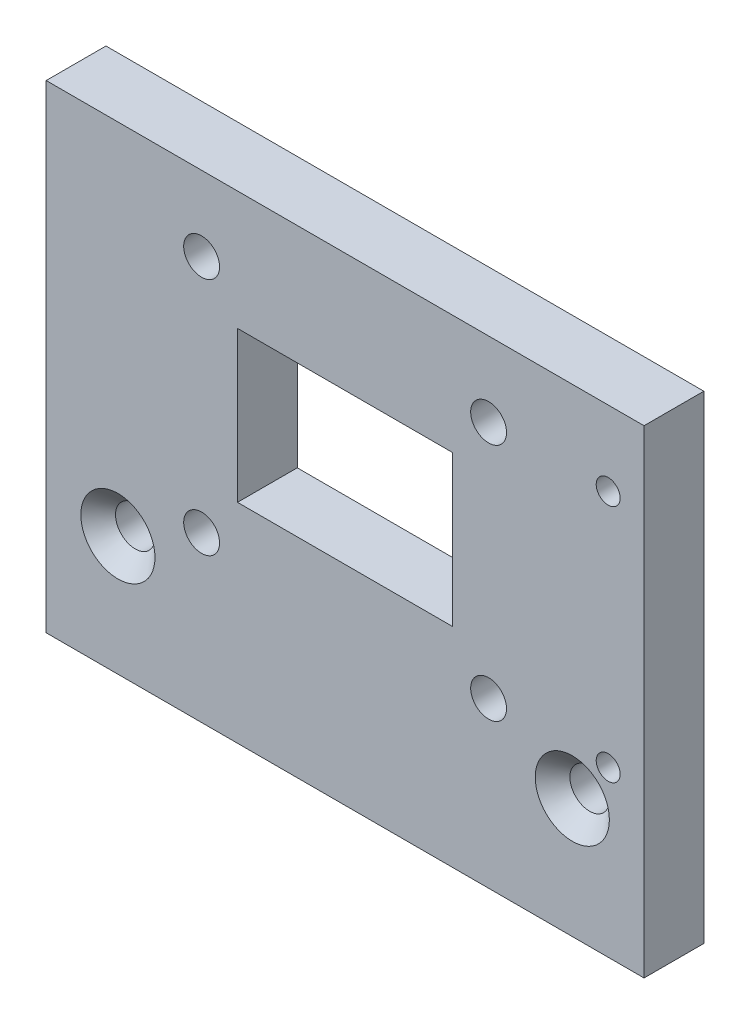
ISO-10303-21;
HEADER;
FILE_DESCRIPTION(('STEP AP214'),'2;1');
FILE_NAME('part.step','',(''),(''),'','','');
FILE_SCHEMA(('AUTOMOTIVE_DESIGN { 1 0 10303 214 1 1 1 1 }'));
ENDSEC;
DATA;
#1=APPLICATION_CONTEXT('core data for automotive mechanical design processes');
#2=APPLICATION_PROTOCOL_DEFINITION('international standard','automotive_design',2000,#1);
#3=PRODUCT_CONTEXT('',#1,'mechanical');
#4=PRODUCT('Part','Part','',(#3));
#5=PRODUCT_RELATED_PRODUCT_CATEGORY('part','',(#4));
#6=PRODUCT_DEFINITION_FORMATION('','',#4);
#7=PRODUCT_DEFINITION_CONTEXT('part definition',#1,'design');
#8=PRODUCT_DEFINITION('design','',#6,#7);
#9=PRODUCT_DEFINITION_SHAPE('','',#8);
#10=(LENGTH_UNIT() NAMED_UNIT(*) SI_UNIT(.MILLI.,.METRE.));
#11=(NAMED_UNIT(*) PLANE_ANGLE_UNIT() SI_UNIT($,.RADIAN.));
#12=(NAMED_UNIT(*) SI_UNIT($,.STERADIAN.) SOLID_ANGLE_UNIT());
#13=UNCERTAINTY_MEASURE_WITH_UNIT(LENGTH_MEASURE(1.E-05),#10,'distance_accuracy_value','');
#14=(GEOMETRIC_REPRESENTATION_CONTEXT(3) GLOBAL_UNCERTAINTY_ASSIGNED_CONTEXT((#13)) GLOBAL_UNIT_ASSIGNED_CONTEXT((#10,
#11,#12)) REPRESENTATION_CONTEXT('',''));
#15=CARTESIAN_POINT('',(0.,0.,0.));
#16=DIRECTION('',(0.,0.,1.));
#17=DIRECTION('',(1.,0.,0.));
#18=AXIS2_PLACEMENT_3D('',#15,#16,#17);
#19=CARTESIAN_POINT('',(12.,20.,10.0022999999965));
#20=DIRECTION('',(0.,0.,1.));
#21=DIRECTION('',(1.,0.,0.));
#22=AXIS2_PLACEMENT_3D('',#19,#20,#21);
#23=CONICAL_SURFACE('',#22,6.1999999999789,0.785398163387648);
#24=CARTESIAN_POINT('',(12.,20.,7.1023));
#25=DIRECTION('',(0.,0.,1.));
#26=DIRECTION('',(1.,0.,0.));
#27=AXIS2_PLACEMENT_3D('',#24,#25,#26);
#28=CIRCLE('',#27,3.3);
#29=CARTESIAN_POINT('',(15.3,20.,7.1023));
#30=VERTEX_POINT('',#29);
#31=EDGE_CURVE('E147',#30,#30,#28,.F.);
#32=ORIENTED_EDGE('',*,*,#31,.T.);
#33=EDGE_LOOP('',(#32));
#34=FACE_BOUND('',#33,.T.);
#35=CARTESIAN_POINT('',(12.,20.,10.0022999999965));
#36=DIRECTION('',(0.,0.,1.));
#37=DIRECTION('',(1.,0.,0.));
#38=AXIS2_PLACEMENT_3D('',#35,#36,#37);
#39=CIRCLE('',#38,6.1999999999789);
#40=CARTESIAN_POINT('',(18.1999999999789,20.,10.0022999999965));
#41=VERTEX_POINT('',#40);
#42=EDGE_CURVE('E19',#41,#41,#39,.F.);
#43=ORIENTED_EDGE('',*,*,#42,.F.);
#44=EDGE_LOOP('',(#43));
#45=FACE_BOUND('',#44,.T.);
#46=ADVANCED_FACE('F16',(#34,#45),#23,.F.);
#47=CARTESIAN_POINT('',(88.,20.,10.0022999999396));
#48=DIRECTION('',(0.,0.,1.));
#49=DIRECTION('',(1.,0.,0.));
#50=AXIS2_PLACEMENT_3D('',#47,#48,#49);
#51=CONICAL_SURFACE('',#50,6.19999999994389,0.785398163397448);
#52=CARTESIAN_POINT('',(88.,20.,7.1023));
#53=DIRECTION('',(0.,0.,1.));
#54=DIRECTION('',(1.,0.,0.));
#55=AXIS2_PLACEMENT_3D('',#52,#53,#54);
#56=CIRCLE('',#55,3.3);
#57=CARTESIAN_POINT('',(91.3,20.,7.1023));
#58=VERTEX_POINT('',#57);
#59=EDGE_CURVE('E141',#58,#58,#56,.F.);
#60=ORIENTED_EDGE('',*,*,#59,.T.);
#61=EDGE_LOOP('',(#60));
#62=FACE_BOUND('',#61,.T.);
#63=CARTESIAN_POINT('',(88.,20.,10.0022999999742));
#64=DIRECTION('',(0.,0.,1.));
#65=DIRECTION('',(1.,0.,0.));
#66=AXIS2_PLACEMENT_3D('',#63,#64,#65);
#67=CIRCLE('',#66,6.19999999997844);
#68=CARTESIAN_POINT('',(94.1999999999784,20.,10.0022999999742));
#69=VERTEX_POINT('',#68);
#70=EDGE_CURVE('E90',#69,#69,#67,.F.);
#71=ORIENTED_EDGE('',*,*,#70,.F.);
#72=EDGE_LOOP('',(#71));
#73=FACE_BOUND('',#72,.T.);
#74=ADVANCED_FACE('F156',(#62,#73),#51,.F.);
#75=CARTESIAN_POINT('',(0.,0.,10.0023));
#76=DIRECTION('',(0.,0.,1.));
#77=DIRECTION('',(1.,0.,0.));
#78=AXIS2_PLACEMENT_3D('',#75,#76,#77);
#79=PLANE('',#78);
#80=CARTESIAN_POINT('',(94.,67.5,10.0023));
#81=DIRECTION('',(0.,0.,1.));
#82=DIRECTION('',(1.,0.,0.));
#83=AXIS2_PLACEMENT_3D('',#80,#81,#82);
#84=CIRCLE('',#83,2.);
#85=CARTESIAN_POINT('',(96.,67.5,10.0023));
#86=VERTEX_POINT('',#85);
#87=EDGE_CURVE('E128',#86,#86,#84,.F.);
#88=ORIENTED_EDGE('',*,*,#87,.T.);
#89=EDGE_LOOP('',(#88));
#90=FACE_BOUND('',#89,.T.);
#91=CARTESIAN_POINT('',(74.,67.5,10.0023));
#92=DIRECTION('',(0.,0.,1.));
#93=DIRECTION('',(1.,0.,0.));
#94=AXIS2_PLACEMENT_3D('',#91,#92,#93);
#95=CIRCLE('',#94,3.);
#96=CARTESIAN_POINT('',(77.,67.5,10.0023));
#97=VERTEX_POINT('',#96);
#98=EDGE_CURVE('E131',#97,#97,#95,.F.);
#99=ORIENTED_EDGE('',*,*,#98,.T.);
#100=EDGE_LOOP('',(#99));
#101=FACE_BOUND('',#100,.T.);
#102=CARTESIAN_POINT('',(26.,67.5,10.0023));
#103=DIRECTION('',(0.,0.,1.));
#104=DIRECTION('',(1.,0.,0.));
#105=AXIS2_PLACEMENT_3D('',#102,#103,#104);
#106=CIRCLE('',#105,3.);
#107=CARTESIAN_POINT('',(29.,67.5,10.0023));
#108=VERTEX_POINT('',#107);
#109=EDGE_CURVE('E134',#108,#108,#106,.F.);
#110=ORIENTED_EDGE('',*,*,#109,.T.);
#111=EDGE_LOOP('',(#110));
#112=FACE_BOUND('',#111,.T.);
#113=DIRECTION('',(0.,1.,0.));
#114=VECTOR('',#113,1.);
#115=CARTESIAN_POINT('',(68.,34.9,10.0023));
#116=LINE('',#115,#114);
#117=CARTESIAN_POINT('',(68.,60.1,10.0023));
#118=VERTEX_POINT('',#117);
#119=CARTESIAN_POINT('',(68.,34.9,10.0023));
#120=VERTEX_POINT('',#119);
#121=EDGE_CURVE('E246',#118,#120,#116,.F.);
#122=ORIENTED_EDGE('',*,*,#121,.T.);
#123=DIRECTION('',(1.,0.,0.));
#124=VECTOR('',#123,1.);
#125=CARTESIAN_POINT('',(32.,34.9,10.0023));
#126=LINE('',#125,#124);
#127=CARTESIAN_POINT('',(32.,34.9,10.0023));
#128=VERTEX_POINT('',#127);
#129=EDGE_CURVE('E255',#128,#120,#126,.T.);
#130=ORIENTED_EDGE('',*,*,#129,.F.);
#131=DIRECTION('',(0.,1.,0.));
#132=VECTOR('',#131,1.);
#133=CARTESIAN_POINT('',(32.,34.9,10.0023));
#134=LINE('',#133,#132);
#135=CARTESIAN_POINT('',(32.,60.1,10.0023));
#136=VERTEX_POINT('',#135);
#137=EDGE_CURVE('E140',#136,#128,#134,.F.);
#138=ORIENTED_EDGE('',*,*,#137,.F.);
#139=DIRECTION('',(1.,0.,0.));
#140=VECTOR('',#139,1.);
#141=CARTESIAN_POINT('',(32.,60.1,10.0023));
#142=LINE('',#141,#140);
#143=EDGE_CURVE('E257',#136,#118,#142,.T.);
#144=ORIENTED_EDGE('',*,*,#143,.T.);
#145=EDGE_LOOP('',(#122,#130,#138,#144));
#146=FACE_BOUND('',#145,.T.);
#147=CARTESIAN_POINT('',(94.,27.5,10.0023));
#148=DIRECTION('',(0.,0.,1.));
#149=DIRECTION('',(1.,0.,0.));
#150=AXIS2_PLACEMENT_3D('',#147,#148,#149);
#151=CIRCLE('',#150,2.);
#152=CARTESIAN_POINT('',(96.,27.5,10.0023));
#153=VERTEX_POINT('',#152);
#154=EDGE_CURVE('E137',#153,#153,#151,.F.);
#155=ORIENTED_EDGE('',*,*,#154,.T.);
#156=EDGE_LOOP('',(#155));
#157=FACE_BOUND('',#156,.T.);
#158=CARTESIAN_POINT('',(74.,27.5,10.0023));
#159=DIRECTION('',(0.,0.,1.));
#160=DIRECTION('',(1.,0.,0.));
#161=AXIS2_PLACEMENT_3D('',#158,#159,#160);
#162=CIRCLE('',#161,3.);
#163=CARTESIAN_POINT('',(77.,27.5,10.0023));
#164=VERTEX_POINT('',#163);
#165=EDGE_CURVE('E142',#164,#164,#162,.F.);
#166=ORIENTED_EDGE('',*,*,#165,.T.);
#167=EDGE_LOOP('',(#166));
#168=FACE_BOUND('',#167,.T.);
#169=ORIENTED_EDGE('',*,*,#70,.T.);
#170=EDGE_LOOP('',(#169));
#171=FACE_BOUND('',#170,.T.);
#172=CARTESIAN_POINT('',(26.,27.5,10.0023));
#173=DIRECTION('',(0.,0.,1.));
#174=DIRECTION('',(1.,0.,0.));
#175=AXIS2_PLACEMENT_3D('',#172,#173,#174);
#176=CIRCLE('',#175,3.);
#177=CARTESIAN_POINT('',(29.,27.5,10.0023));
#178=VERTEX_POINT('',#177);
#179=EDGE_CURVE('E145',#178,#178,#176,.F.);
#180=ORIENTED_EDGE('',*,*,#179,.T.);
#181=EDGE_LOOP('',(#180));
#182=FACE_BOUND('',#181,.T.);
#183=ORIENTED_EDGE('',*,*,#42,.T.);
#184=EDGE_LOOP('',(#183));
#185=FACE_BOUND('',#184,.T.);
#186=DIRECTION('',(0.,1.,0.));
#187=VECTOR('',#186,1.);
#188=CARTESIAN_POINT('',(100.,0.,10.0023));
#189=LINE('',#188,#187);
#190=CARTESIAN_POINT('',(100.,80.,10.0023));
#191=VERTEX_POINT('',#190);
#192=CARTESIAN_POINT('',(100.,0.,10.0023));
#193=VERTEX_POINT('',#192);
#194=EDGE_CURVE('E286',#191,#193,#189,.F.);
#195=ORIENTED_EDGE('',*,*,#194,.F.);
#196=DIRECTION('',(1.,0.,0.));
#197=VECTOR('',#196,1.);
#198=CARTESIAN_POINT('',(0.,80.,10.0023));
#199=LINE('',#198,#197);
#200=CARTESIAN_POINT('',(0.,80.,10.0023));
#201=VERTEX_POINT('',#200);
#202=EDGE_CURVE('E84',#201,#191,#199,.T.);
#203=ORIENTED_EDGE('',*,*,#202,.F.);
#204=DIRECTION('',(0.,1.,0.));
#205=VECTOR('',#204,1.);
#206=CARTESIAN_POINT('',(0.,0.,10.0023));
#207=LINE('',#206,#205);
#208=CARTESIAN_POINT('',(0.,0.,10.0023));
#209=VERTEX_POINT('',#208);
#210=EDGE_CURVE('E82',#201,#209,#207,.F.);
#211=ORIENTED_EDGE('',*,*,#210,.T.);
#212=DIRECTION('',(1.,0.,0.));
#213=VECTOR('',#212,1.);
#214=CARTESIAN_POINT('',(0.,0.,10.0023));
#215=LINE('',#214,#213);
#216=EDGE_CURVE('E79',#209,#193,#215,.T.);
#217=ORIENTED_EDGE('',*,*,#216,.T.);
#218=EDGE_LOOP('',(#195,#203,#211,#217));
#219=FACE_BOUND('',#218,.T.);
#220=ADVANCED_FACE('F83',(#90,#101,#112,#146,#157,#168,#171,#182,#185,#219),#79,.T.);
#221=CARTESIAN_POINT('',(0.,0.,0.002300000000105));
#222=DIRECTION('',(1.,0.,0.));
#223=DIRECTION('',(0.,0.,-1.));
#224=AXIS2_PLACEMENT_3D('',#221,#222,#223);
#225=PLANE('',#224);
#226=DIRECTION('',(0.,0.,1.));
#227=VECTOR('',#226,1.);
#228=CARTESIAN_POINT('',(0.,80.,0.002300000000105));
#229=LINE('',#228,#227);
#230=CARTESIAN_POINT('',(0.,80.,0.002300000000105));
#231=VERTEX_POINT('',#230);
#232=EDGE_CURVE('E284',#231,#201,#229,.T.);
#233=ORIENTED_EDGE('',*,*,#232,.F.);
#234=DIRECTION('',(0.,1.,0.));
#235=VECTOR('',#234,1.);
#236=CARTESIAN_POINT('',(0.,0.,0.002300000000105));
#237=LINE('',#236,#235);
#238=CARTESIAN_POINT('',(0.,0.,0.002300000000105));
#239=VERTEX_POINT('',#238);
#240=EDGE_CURVE('E101',#231,#239,#237,.F.);
#241=ORIENTED_EDGE('',*,*,#240,.T.);
#242=DIRECTION('',(0.,0.,1.));
#243=VECTOR('',#242,1.);
#244=CARTESIAN_POINT('',(0.,0.,0.002300000000105));
#245=LINE('',#244,#243);
#246=EDGE_CURVE('E89',#239,#209,#245,.T.);
#247=ORIENTED_EDGE('',*,*,#246,.T.);
#248=ORIENTED_EDGE('',*,*,#210,.F.);
#249=EDGE_LOOP('',(#233,#241,#247,#248));
#250=FACE_BOUND('',#249,.T.);
#251=ADVANCED_FACE('F100',(#250),#225,.F.);
#252=CARTESIAN_POINT('',(0.,0.,0.002300000000105));
#253=DIRECTION('',(0.,1.,0.));
#254=DIRECTION('',(0.,0.,1.));
#255=AXIS2_PLACEMENT_3D('',#252,#253,#254);
#256=PLANE('',#255);
#257=ORIENTED_EDGE('',*,*,#216,.F.);
#258=ORIENTED_EDGE('',*,*,#246,.F.);
#259=DIRECTION('',(1.,0.,0.));
#260=VECTOR('',#259,1.);
#261=CARTESIAN_POINT('',(0.,0.,0.002300000000105));
#262=LINE('',#261,#260);
#263=CARTESIAN_POINT('',(100.,0.,0.002300000000105));
#264=VERTEX_POINT('',#263);
#265=EDGE_CURVE('E293',#239,#264,#262,.T.);
#266=ORIENTED_EDGE('',*,*,#265,.T.);
#267=DIRECTION('',(0.,0.,-1.));
#268=VECTOR('',#267,1.);
#269=CARTESIAN_POINT('',(100.,0.,0.002300000000105));
#270=LINE('',#269,#268);
#271=EDGE_CURVE('E97',#193,#264,#270,.T.);
#272=ORIENTED_EDGE('',*,*,#271,.F.);
#273=EDGE_LOOP('',(#257,#258,#266,#272));
#274=FACE_BOUND('',#273,.T.);
#275=ADVANCED_FACE('F94',(#274),#256,.F.);
#276=CARTESIAN_POINT('',(100.,0.,0.002300000000105));
#277=DIRECTION('',(1.,0.,0.));
#278=DIRECTION('',(0.,0.,-1.));
#279=AXIS2_PLACEMENT_3D('',#276,#277,#278);
#280=PLANE('',#279);
#281=DIRECTION('',(0.,0.,1.));
#282=VECTOR('',#281,1.);
#283=CARTESIAN_POINT('',(100.,80.,0.002300000000105));
#284=LINE('',#283,#282);
#285=CARTESIAN_POINT('',(100.,80.,0.002300000000105));
#286=VERTEX_POINT('',#285);
#287=EDGE_CURVE('E281',#191,#286,#284,.F.);
#288=ORIENTED_EDGE('',*,*,#287,.F.);
#289=ORIENTED_EDGE('',*,*,#194,.T.);
#290=ORIENTED_EDGE('',*,*,#271,.T.);
#291=DIRECTION('',(0.,1.,0.));
#292=VECTOR('',#291,1.);
#293=CARTESIAN_POINT('',(100.,0.,0.002300000000105));
#294=LINE('',#293,#292);
#295=EDGE_CURVE('E290',#264,#286,#294,.T.);
#296=ORIENTED_EDGE('',*,*,#295,.T.);
#297=EDGE_LOOP('',(#288,#289,#290,#296));
#298=FACE_BOUND('',#297,.T.);
#299=ADVANCED_FACE('F223',(#298),#280,.T.);
#300=CARTESIAN_POINT('',(0.,80.,0.002300000000105));
#301=DIRECTION('',(0.,1.,0.));
#302=DIRECTION('',(0.,0.,1.));
#303=AXIS2_PLACEMENT_3D('',#300,#301,#302);
#304=PLANE('',#303);
#305=ORIENTED_EDGE('',*,*,#202,.T.);
#306=ORIENTED_EDGE('',*,*,#287,.T.);
#307=DIRECTION('',(1.,0.,0.));
#308=VECTOR('',#307,1.);
#309=CARTESIAN_POINT('',(0.,80.,0.002300000000105));
#310=LINE('',#309,#308);
#311=EDGE_CURVE('E127',#286,#231,#310,.F.);
#312=ORIENTED_EDGE('',*,*,#311,.T.);
#313=ORIENTED_EDGE('',*,*,#232,.T.);
#314=EDGE_LOOP('',(#305,#306,#312,#313));
#315=FACE_BOUND('',#314,.T.);
#316=ADVANCED_FACE('F219',(#315),#304,.T.);
#317=CARTESIAN_POINT('',(12.,20.,0.002300000000105));
#318=DIRECTION('',(0.,0.,1.));
#319=DIRECTION('',(1.,0.,0.));
#320=AXIS2_PLACEMENT_3D('',#317,#318,#319);
#321=CYLINDRICAL_SURFACE('',#320,3.3);
#322=CARTESIAN_POINT('',(12.,20.,0.002300000000105));
#323=DIRECTION('',(0.,0.,1.));
#324=DIRECTION('',(1.,0.,0.));
#325=AXIS2_PLACEMENT_3D('',#322,#323,#324);
#326=CIRCLE('',#325,3.3);
#327=CARTESIAN_POINT('',(15.3,20.,0.002300000000105));
#328=VERTEX_POINT('',#327);
#329=EDGE_CURVE('E124',#328,#328,#326,.F.);
#330=ORIENTED_EDGE('',*,*,#329,.T.);
#331=EDGE_LOOP('',(#330));
#332=FACE_BOUND('',#331,.T.);
#333=ORIENTED_EDGE('',*,*,#31,.F.);
#334=EDGE_LOOP('',(#333));
#335=FACE_BOUND('',#334,.T.);
#336=ADVANCED_FACE('F215',(#332,#335),#321,.F.);
#337=CARTESIAN_POINT('',(26.,27.5,0.002300000000105));
#338=DIRECTION('',(0.,0.,1.));
#339=DIRECTION('',(1.,0.,0.));
#340=AXIS2_PLACEMENT_3D('',#337,#338,#339);
#341=CYLINDRICAL_SURFACE('',#340,3.);
#342=CARTESIAN_POINT('',(26.,27.5,0.002300000000105));
#343=DIRECTION('',(0.,0.,1.));
#344=DIRECTION('',(1.,0.,0.));
#345=AXIS2_PLACEMENT_3D('',#342,#343,#344);
#346=CIRCLE('',#345,3.);
#347=CARTESIAN_POINT('',(29.,27.5,0.002300000000105));
#348=VERTEX_POINT('',#347);
#349=EDGE_CURVE('E121',#348,#348,#346,.F.);
#350=ORIENTED_EDGE('',*,*,#349,.T.);
#351=EDGE_LOOP('',(#350));
#352=FACE_BOUND('',#351,.T.);
#353=ORIENTED_EDGE('',*,*,#179,.F.);
#354=EDGE_LOOP('',(#353));
#355=FACE_BOUND('',#354,.T.);
#356=ADVANCED_FACE('F211',(#352,#355),#341,.F.);
#357=CARTESIAN_POINT('',(74.,27.5,0.002300000000105));
#358=DIRECTION('',(0.,0.,1.));
#359=DIRECTION('',(1.,0.,0.));
#360=AXIS2_PLACEMENT_3D('',#357,#358,#359);
#361=CYLINDRICAL_SURFACE('',#360,3.);
#362=CARTESIAN_POINT('',(74.,27.5,0.002300000000105));
#363=DIRECTION('',(0.,0.,1.));
#364=DIRECTION('',(1.,0.,0.));
#365=AXIS2_PLACEMENT_3D('',#362,#363,#364);
#366=CIRCLE('',#365,3.);
#367=CARTESIAN_POINT('',(77.,27.5,0.002300000000105));
#368=VERTEX_POINT('',#367);
#369=EDGE_CURVE('E118',#368,#368,#366,.F.);
#370=ORIENTED_EDGE('',*,*,#369,.T.);
#371=EDGE_LOOP('',(#370));
#372=FACE_BOUND('',#371,.T.);
#373=ORIENTED_EDGE('',*,*,#165,.F.);
#374=EDGE_LOOP('',(#373));
#375=FACE_BOUND('',#374,.T.);
#376=ADVANCED_FACE('F207',(#372,#375),#361,.F.);
#377=CARTESIAN_POINT('',(88.,20.,0.002300000000105));
#378=DIRECTION('',(0.,0.,1.));
#379=DIRECTION('',(1.,0.,0.));
#380=AXIS2_PLACEMENT_3D('',#377,#378,#379);
#381=CYLINDRICAL_SURFACE('',#380,3.3);
#382=CARTESIAN_POINT('',(88.,20.,0.002300000000105));
#383=DIRECTION('',(0.,0.,1.));
#384=DIRECTION('',(1.,0.,0.));
#385=AXIS2_PLACEMENT_3D('',#382,#383,#384);
#386=CIRCLE('',#385,3.3);
#387=CARTESIAN_POINT('',(91.3,20.,0.002300000000105));
#388=VERTEX_POINT('',#387);
#389=EDGE_CURVE('E115',#388,#388,#386,.F.);
#390=ORIENTED_EDGE('',*,*,#389,.T.);
#391=EDGE_LOOP('',(#390));
#392=FACE_BOUND('',#391,.T.);
#393=ORIENTED_EDGE('',*,*,#59,.F.);
#394=EDGE_LOOP('',(#393));
#395=FACE_BOUND('',#394,.T.);
#396=ADVANCED_FACE('F203',(#392,#395),#381,.F.);
#397=CARTESIAN_POINT('',(94.,27.5,0.002300000000105));
#398=DIRECTION('',(0.,0.,1.));
#399=DIRECTION('',(1.,0.,0.));
#400=AXIS2_PLACEMENT_3D('',#397,#398,#399);
#401=CYLINDRICAL_SURFACE('',#400,2.);
#402=CARTESIAN_POINT('',(94.,27.5,0.002300000000105));
#403=DIRECTION('',(0.,0.,1.));
#404=DIRECTION('',(1.,0.,0.));
#405=AXIS2_PLACEMENT_3D('',#402,#403,#404);
#406=CIRCLE('',#405,2.);
#407=CARTESIAN_POINT('',(96.,27.5,0.002300000000105));
#408=VERTEX_POINT('',#407);
#409=EDGE_CURVE('E111',#408,#408,#406,.F.);
#410=ORIENTED_EDGE('',*,*,#409,.T.);
#411=EDGE_LOOP('',(#410));
#412=FACE_BOUND('',#411,.T.);
#413=ORIENTED_EDGE('',*,*,#154,.F.);
#414=EDGE_LOOP('',(#413));
#415=FACE_BOUND('',#414,.T.);
#416=ADVANCED_FACE('F199',(#412,#415),#401,.F.);
#417=CARTESIAN_POINT('',(32.,34.9,0.002300000000105));
#418=DIRECTION('',(1.,0.,0.));
#419=DIRECTION('',(0.,0.,-1.));
#420=AXIS2_PLACEMENT_3D('',#417,#418,#419);
#421=PLANE('',#420);
#422=DIRECTION('',(0.,0.,1.));
#423=VECTOR('',#422,1.);
#424=CARTESIAN_POINT('',(32.,60.1,0.002300000000105));
#425=LINE('',#424,#423);
#426=CARTESIAN_POINT('',(32.,60.1,0.002300000000105));
#427=VERTEX_POINT('',#426);
#428=EDGE_CURVE('E274',#427,#136,#425,.T.);
#429=ORIENTED_EDGE('',*,*,#428,.T.);
#430=ORIENTED_EDGE('',*,*,#137,.T.);
#431=DIRECTION('',(0.,0.,1.));
#432=VECTOR('',#431,1.);
#433=CARTESIAN_POINT('',(32.,34.9,0.002300000000105));
#434=LINE('',#433,#432);
#435=CARTESIAN_POINT('',(32.,34.9,0.002300000000105));
#436=VERTEX_POINT('',#435);
#437=EDGE_CURVE('E259',#436,#128,#434,.T.);
#438=ORIENTED_EDGE('',*,*,#437,.F.);
#439=DIRECTION('',(0.,1.,0.));
#440=VECTOR('',#439,1.);
#441=CARTESIAN_POINT('',(32.,0.,0.002300000000105));
#442=LINE('',#441,#440);
#443=EDGE_CURVE('E114',#436,#427,#442,.T.);
#444=ORIENTED_EDGE('',*,*,#443,.T.);
#445=EDGE_LOOP('',(#429,#430,#438,#444));
#446=FACE_BOUND('',#445,.T.);
#447=ADVANCED_FACE('F195',(#446),#421,.T.);
#448=CARTESIAN_POINT('',(32.,60.1,0.002300000000105));
#449=DIRECTION('',(0.,1.,0.));
#450=DIRECTION('',(0.,0.,1.));
#451=AXIS2_PLACEMENT_3D('',#448,#449,#450);
#452=PLANE('',#451);
#453=ORIENTED_EDGE('',*,*,#143,.F.);
#454=ORIENTED_EDGE('',*,*,#428,.F.);
#455=DIRECTION('',(1.,0.,0.));
#456=VECTOR('',#455,1.);
#457=CARTESIAN_POINT('',(0.,60.1,0.002300000000105));
#458=LINE('',#457,#456);
#459=CARTESIAN_POINT('',(68.,60.1,0.002300000000105));
#460=VERTEX_POINT('',#459);
#461=EDGE_CURVE('E300',#427,#460,#458,.T.);
#462=ORIENTED_EDGE('',*,*,#461,.T.);
#463=DIRECTION('',(0.,0.,-1.));
#464=VECTOR('',#463,1.);
#465=CARTESIAN_POINT('',(68.,60.1,0.002300000000105));
#466=LINE('',#465,#464);
#467=EDGE_CURVE('E260',#460,#118,#466,.F.);
#468=ORIENTED_EDGE('',*,*,#467,.T.);
#469=EDGE_LOOP('',(#453,#454,#462,#468));
#470=FACE_BOUND('',#469,.T.);
#471=ADVANCED_FACE('F191',(#470),#452,.F.);
#472=CARTESIAN_POINT('',(68.,34.9,0.002300000000105));
#473=DIRECTION('',(1.,0.,0.));
#474=DIRECTION('',(0.,0.,-1.));
#475=AXIS2_PLACEMENT_3D('',#472,#473,#474);
#476=PLANE('',#475);
#477=ORIENTED_EDGE('',*,*,#467,.F.);
#478=DIRECTION('',(0.,1.,0.));
#479=VECTOR('',#478,1.);
#480=CARTESIAN_POINT('',(68.,0.,0.002300000000105));
#481=LINE('',#480,#479);
#482=CARTESIAN_POINT('',(68.,34.9,0.002300000000105));
#483=VERTEX_POINT('',#482);
#484=EDGE_CURVE('E264',#460,#483,#481,.F.);
#485=ORIENTED_EDGE('',*,*,#484,.T.);
#486=DIRECTION('',(0.,0.,1.));
#487=VECTOR('',#486,1.);
#488=CARTESIAN_POINT('',(68.,34.9,0.002300000000105));
#489=LINE('',#488,#487);
#490=EDGE_CURVE('E34',#120,#483,#489,.F.);
#491=ORIENTED_EDGE('',*,*,#490,.F.);
#492=ORIENTED_EDGE('',*,*,#121,.F.);
#493=EDGE_LOOP('',(#477,#485,#491,#492));
#494=FACE_BOUND('',#493,.T.);
#495=ADVANCED_FACE('F188',(#494),#476,.F.);
#496=CARTESIAN_POINT('',(32.,34.9,0.002300000000105));
#497=DIRECTION('',(0.,1.,0.));
#498=DIRECTION('',(0.,0.,1.));
#499=AXIS2_PLACEMENT_3D('',#496,#497,#498);
#500=PLANE('',#499);
#501=ORIENTED_EDGE('',*,*,#129,.T.);
#502=ORIENTED_EDGE('',*,*,#490,.T.);
#503=DIRECTION('',(1.,0.,0.));
#504=VECTOR('',#503,1.);
#505=CARTESIAN_POINT('',(0.,34.9,0.002300000000105));
#506=LINE('',#505,#504);
#507=EDGE_CURVE('E110',#483,#436,#506,.F.);
#508=ORIENTED_EDGE('',*,*,#507,.T.);
#509=ORIENTED_EDGE('',*,*,#437,.T.);
#510=EDGE_LOOP('',(#501,#502,#508,#509));
#511=FACE_BOUND('',#510,.T.);
#512=ADVANCED_FACE('F184',(#511),#500,.T.);
#513=CARTESIAN_POINT('',(26.,67.5,0.002300000000105));
#514=DIRECTION('',(0.,0.,1.));
#515=DIRECTION('',(1.,0.,0.));
#516=AXIS2_PLACEMENT_3D('',#513,#514,#515);
#517=CYLINDRICAL_SURFACE('',#516,3.);
#518=CARTESIAN_POINT('',(26.,67.5,0.002300000000105));
#519=DIRECTION('',(0.,0.,1.));
#520=DIRECTION('',(1.,0.,0.));
#521=AXIS2_PLACEMENT_3D('',#518,#519,#520);
#522=CIRCLE('',#521,3.);
#523=CARTESIAN_POINT('',(29.,67.5,0.002300000000105));
#524=VERTEX_POINT('',#523);
#525=EDGE_CURVE('E107',#524,#524,#522,.F.);
#526=ORIENTED_EDGE('',*,*,#525,.T.);
#527=EDGE_LOOP('',(#526));
#528=FACE_BOUND('',#527,.T.);
#529=ORIENTED_EDGE('',*,*,#109,.F.);
#530=EDGE_LOOP('',(#529));
#531=FACE_BOUND('',#530,.T.);
#532=ADVANCED_FACE('F180',(#528,#531),#517,.F.);
#533=CARTESIAN_POINT('',(74.,67.5,0.002300000000105));
#534=DIRECTION('',(0.,0.,1.));
#535=DIRECTION('',(1.,0.,0.));
#536=AXIS2_PLACEMENT_3D('',#533,#534,#535);
#537=CYLINDRICAL_SURFACE('',#536,3.);
#538=CARTESIAN_POINT('',(74.,67.5,0.002300000000105));
#539=DIRECTION('',(0.,0.,1.));
#540=DIRECTION('',(1.,0.,0.));
#541=AXIS2_PLACEMENT_3D('',#538,#539,#540);
#542=CIRCLE('',#541,3.);
#543=CARTESIAN_POINT('',(77.,67.5,0.002300000000105));
#544=VERTEX_POINT('',#543);
#545=EDGE_CURVE('E25',#544,#544,#542,.F.);
#546=ORIENTED_EDGE('',*,*,#545,.T.);
#547=EDGE_LOOP('',(#546));
#548=FACE_BOUND('',#547,.T.);
#549=ORIENTED_EDGE('',*,*,#98,.F.);
#550=EDGE_LOOP('',(#549));
#551=FACE_BOUND('',#550,.T.);
#552=ADVANCED_FACE('F172',(#548,#551),#537,.F.);
#553=CARTESIAN_POINT('',(94.,67.5,0.002300000000105));
#554=DIRECTION('',(0.,0.,1.));
#555=DIRECTION('',(1.,0.,0.));
#556=AXIS2_PLACEMENT_3D('',#553,#554,#555);
#557=CYLINDRICAL_SURFACE('',#556,2.);
#558=CARTESIAN_POINT('',(94.,67.5,0.002300000000105));
#559=DIRECTION('',(0.,0.,1.));
#560=DIRECTION('',(1.,0.,0.));
#561=AXIS2_PLACEMENT_3D('',#558,#559,#560);
#562=CIRCLE('',#561,2.);
#563=CARTESIAN_POINT('',(96.,67.5,0.002300000000105));
#564=VERTEX_POINT('',#563);
#565=EDGE_CURVE('E11',#564,#564,#562,.F.);
#566=ORIENTED_EDGE('',*,*,#565,.T.);
#567=EDGE_LOOP('',(#566));
#568=FACE_BOUND('',#567,.T.);
#569=ORIENTED_EDGE('',*,*,#87,.F.);
#570=EDGE_LOOP('',(#569));
#571=FACE_BOUND('',#570,.T.);
#572=ADVANCED_FACE('F166',(#568,#571),#557,.F.);
#573=CARTESIAN_POINT('',(0.,0.,0.002300000000105));
#574=DIRECTION('',(0.,0.,1.));
#575=DIRECTION('',(1.,0.,0.));
#576=AXIS2_PLACEMENT_3D('',#573,#574,#575);
#577=PLANE('',#576);
#578=ORIENTED_EDGE('',*,*,#565,.F.);
#579=EDGE_LOOP('',(#578));
#580=FACE_BOUND('',#579,.T.);
#581=ORIENTED_EDGE('',*,*,#545,.F.);
#582=EDGE_LOOP('',(#581));
#583=FACE_BOUND('',#582,.T.);
#584=ORIENTED_EDGE('',*,*,#525,.F.);
#585=EDGE_LOOP('',(#584));
#586=FACE_BOUND('',#585,.T.);
#587=ORIENTED_EDGE('',*,*,#484,.F.);
#588=ORIENTED_EDGE('',*,*,#461,.F.);
#589=ORIENTED_EDGE('',*,*,#443,.F.);
#590=ORIENTED_EDGE('',*,*,#507,.F.);
#591=EDGE_LOOP('',(#587,#588,#589,#590));
#592=FACE_BOUND('',#591,.T.);
#593=ORIENTED_EDGE('',*,*,#409,.F.);
#594=EDGE_LOOP('',(#593));
#595=FACE_BOUND('',#594,.T.);
#596=ORIENTED_EDGE('',*,*,#389,.F.);
#597=EDGE_LOOP('',(#596));
#598=FACE_BOUND('',#597,.T.);
#599=ORIENTED_EDGE('',*,*,#369,.F.);
#600=EDGE_LOOP('',(#599));
#601=FACE_BOUND('',#600,.T.);
#602=ORIENTED_EDGE('',*,*,#349,.F.);
#603=EDGE_LOOP('',(#602));
#604=FACE_BOUND('',#603,.T.);
#605=ORIENTED_EDGE('',*,*,#329,.F.);
#606=EDGE_LOOP('',(#605));
#607=FACE_BOUND('',#606,.T.);
#608=ORIENTED_EDGE('',*,*,#295,.F.);
#609=ORIENTED_EDGE('',*,*,#265,.F.);
#610=ORIENTED_EDGE('',*,*,#240,.F.);
#611=ORIENTED_EDGE('',*,*,#311,.F.);
#612=EDGE_LOOP('',(#608,#609,#610,#611));
#613=FACE_BOUND('',#612,.T.);
#614=ADVANCED_FACE('F164',(#580,#583,#586,#592,#595,#598,#601,#604,#607,#613),#577,.F.);
#615=CLOSED_SHELL('',(#46,#74,#220,#251,#275,#299,#316,#336,#356,#376,#396,#416,#447,#471,#495,
#512,#532,#552,#572,#614));
#616=MANIFOLD_SOLID_BREP('B1',#615);
#617=ADVANCED_BREP_SHAPE_REPRESENTATION('',(#18,#616),#14);
#618=SHAPE_DEFINITION_REPRESENTATION(#9,#617);
ENDSEC;
END-ISO-10303-21;
